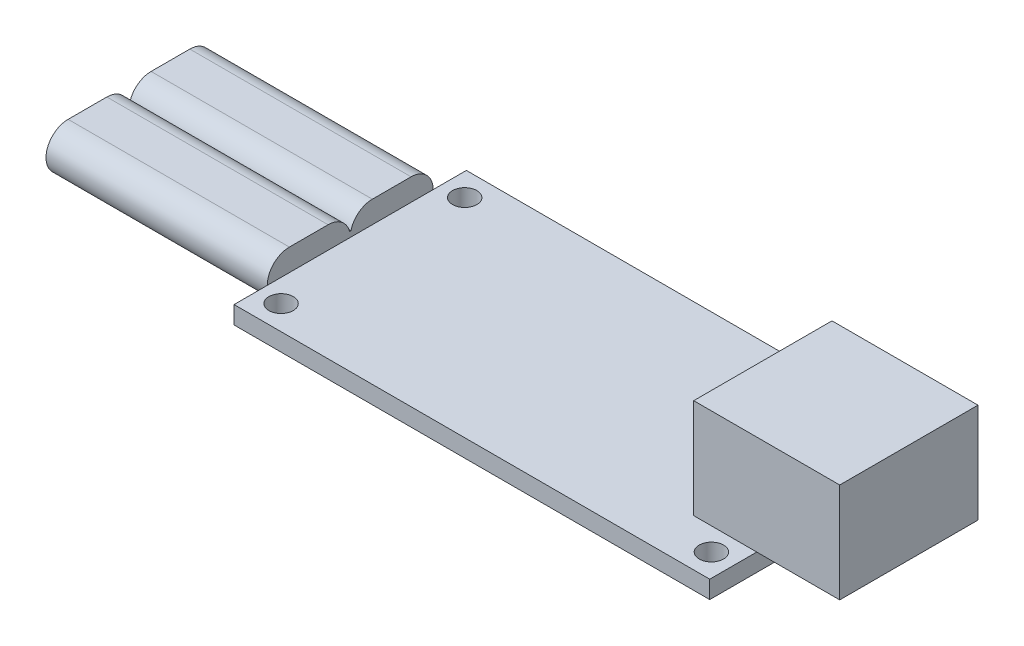
ISO-10303-21;
HEADER;
FILE_DESCRIPTION(('STEP AP214'),'2;1');
FILE_NAME('part.step','',(''),(''),'','','');
FILE_SCHEMA(('AUTOMOTIVE_DESIGN { 1 0 10303 214 1 1 1 1 }'));
ENDSEC;
DATA;
#1=APPLICATION_CONTEXT('core data for automotive mechanical design processes');
#2=APPLICATION_PROTOCOL_DEFINITION('international standard','automotive_design',2000,#1);
#3=PRODUCT_CONTEXT('',#1,'mechanical');
#4=PRODUCT('Part','Part','',(#3));
#5=PRODUCT_RELATED_PRODUCT_CATEGORY('part','',(#4));
#6=PRODUCT_DEFINITION_FORMATION('','',#4);
#7=PRODUCT_DEFINITION_CONTEXT('part definition',#1,'design');
#8=PRODUCT_DEFINITION('design','',#6,#7);
#9=PRODUCT_DEFINITION_SHAPE('','',#8);
#10=(LENGTH_UNIT() NAMED_UNIT(*) SI_UNIT(.MILLI.,.METRE.));
#11=(NAMED_UNIT(*) PLANE_ANGLE_UNIT() SI_UNIT($,.RADIAN.));
#12=(NAMED_UNIT(*) SI_UNIT($,.STERADIAN.) SOLID_ANGLE_UNIT());
#13=UNCERTAINTY_MEASURE_WITH_UNIT(LENGTH_MEASURE(1.E-05),#10,'distance_accuracy_value','');
#14=(GEOMETRIC_REPRESENTATION_CONTEXT(3) GLOBAL_UNCERTAINTY_ASSIGNED_CONTEXT((#13)) GLOBAL_UNIT_ASSIGNED_CONTEXT((#10,
#11,#12)) REPRESENTATION_CONTEXT('',''));
#15=CARTESIAN_POINT('',(0.,0.,0.));
#16=DIRECTION('',(0.,0.,1.));
#17=DIRECTION('',(1.,0.,0.));
#18=AXIS2_PLACEMENT_3D('',#15,#16,#17);
#19=CARTESIAN_POINT('',(0.,1.6,0.));
#20=DIRECTION('',(0.,-1.,0.));
#21=DIRECTION('',(0.,0.,-1.));
#22=AXIS2_PLACEMENT_3D('',#19,#20,#21);
#23=PLANE('',#22);
#24=CARTESIAN_POINT('',(2.05000000000009,1.6,-2.2));
#25=DIRECTION('',(0.,1.,0.));
#26=DIRECTION('',(0.,0.,1.));
#27=AXIS2_PLACEMENT_3D('',#24,#25,#26);
#28=CIRCLE('',#27,1.1);
#29=CARTESIAN_POINT('',(2.05000000000009,1.6,-1.1));
#30=VERTEX_POINT('',#29);
#31=EDGE_CURVE('E321',#30,#30,#28,.T.);
#32=ORIENTED_EDGE('',*,*,#31,.F.);
#33=EDGE_LOOP('',(#32));
#34=FACE_BOUND('',#33,.T.);
#35=CARTESIAN_POINT('',(40.9500000000001,1.6,-2.2));
#36=DIRECTION('',(0.,1.,0.));
#37=DIRECTION('',(0.,0.,1.));
#38=AXIS2_PLACEMENT_3D('',#35,#36,#37);
#39=CIRCLE('',#38,1.1);
#40=CARTESIAN_POINT('',(40.9500000000001,1.6,-1.1));
#41=VERTEX_POINT('',#40);
#42=EDGE_CURVE('E327',#41,#41,#39,.T.);
#43=ORIENTED_EDGE('',*,*,#42,.F.);
#44=EDGE_LOOP('',(#43));
#45=FACE_BOUND('',#44,.T.);
#46=CARTESIAN_POINT('',(40.9499999999999,1.6,-18.8));
#47=DIRECTION('',(0.,1.,0.));
#48=DIRECTION('',(0.,0.,1.));
#49=AXIS2_PLACEMENT_3D('',#46,#47,#48);
#50=CIRCLE('',#49,1.1);
#51=CARTESIAN_POINT('',(40.9499999999999,1.6,-17.7));
#52=VERTEX_POINT('',#51);
#53=EDGE_CURVE('E333',#52,#52,#50,.T.);
#54=ORIENTED_EDGE('',*,*,#53,.F.);
#55=EDGE_LOOP('',(#54));
#56=FACE_BOUND('',#55,.T.);
#57=CARTESIAN_POINT('',(2.04999999999991,1.6,-18.8));
#58=DIRECTION('',(0.,1.,0.));
#59=DIRECTION('',(0.,0.,1.));
#60=AXIS2_PLACEMENT_3D('',#57,#58,#59);
#61=CIRCLE('',#60,1.1);
#62=CARTESIAN_POINT('',(2.04999999999991,1.6,-17.7));
#63=VERTEX_POINT('',#62);
#64=EDGE_CURVE('E339',#63,#63,#61,.T.);
#65=ORIENTED_EDGE('',*,*,#64,.F.);
#66=EDGE_LOOP('',(#65));
#67=FACE_BOUND('',#66,.T.);
#68=DIRECTION('',(1.,0.,0.));
#69=VECTOR('',#68,1.);
#70=CARTESIAN_POINT('',(37.3,1.6,-4.25));
#71=LINE('',#70,#69);
#72=CARTESIAN_POINT('',(37.3,1.6,-4.25));
#73=VERTEX_POINT('',#72);
#74=CARTESIAN_POINT('',(43.,1.6,-4.25));
#75=VERTEX_POINT('',#74);
#76=EDGE_CURVE('E54',#73,#75,#71,.T.);
#77=ORIENTED_EDGE('',*,*,#76,.F.);
#78=DIRECTION('',(0.,0.,1.));
#79=VECTOR('',#78,1.);
#80=CARTESIAN_POINT('',(37.3,1.6,-16.75));
#81=LINE('',#80,#79);
#82=CARTESIAN_POINT('',(37.3,1.6,-16.75));
#83=VERTEX_POINT('',#82);
#84=EDGE_CURVE('E59',#83,#73,#81,.T.);
#85=ORIENTED_EDGE('',*,*,#84,.F.);
#86=DIRECTION('',(-1.,0.,0.));
#87=VECTOR('',#86,1.);
#88=CARTESIAN_POINT('',(37.3,1.6,-16.75));
#89=LINE('',#88,#87);
#90=CARTESIAN_POINT('',(43.,1.6,-16.75));
#91=VERTEX_POINT('',#90);
#92=EDGE_CURVE('E448',#91,#83,#89,.T.);
#93=ORIENTED_EDGE('',*,*,#92,.F.);
#94=DIRECTION('',(0.,0.,-1.));
#95=VECTOR('',#94,1.);
#96=CARTESIAN_POINT('',(43.,1.6,0.));
#97=LINE('',#96,#95);
#98=CARTESIAN_POINT('',(43.,1.6,-21.));
#99=VERTEX_POINT('',#98);
#100=EDGE_CURVE('E352',#91,#99,#97,.T.);
#101=ORIENTED_EDGE('',*,*,#100,.T.);
#102=DIRECTION('',(-1.,0.,0.));
#103=VECTOR('',#102,1.);
#104=CARTESIAN_POINT('',(0.,1.6,-21.));
#105=LINE('',#104,#103);
#106=CARTESIAN_POINT('',(0.,1.6,-21.));
#107=VERTEX_POINT('',#106);
#108=EDGE_CURVE('E355',#99,#107,#105,.T.);
#109=ORIENTED_EDGE('',*,*,#108,.T.);
#110=DIRECTION('',(0.,0.,1.));
#111=VECTOR('',#110,1.);
#112=CARTESIAN_POINT('',(0.,1.6,0.));
#113=LINE('',#112,#111);
#114=CARTESIAN_POINT('',(0.,1.6,-18.));
#115=VERTEX_POINT('',#114);
#116=EDGE_CURVE('E345',#107,#115,#113,.T.);
#117=ORIENTED_EDGE('',*,*,#116,.T.);
#118=CARTESIAN_POINT('',(0.,1.6,-3.));
#119=VERTEX_POINT('',#118);
#120=EDGE_CURVE('E349',#115,#119,#113,.T.);
#121=ORIENTED_EDGE('',*,*,#120,.T.);
#122=CARTESIAN_POINT('',(0.,1.6,0.));
#123=VERTEX_POINT('',#122);
#124=EDGE_CURVE('E350',#119,#123,#113,.T.);
#125=ORIENTED_EDGE('',*,*,#124,.T.);
#126=DIRECTION('',(1.,0.,0.));
#127=VECTOR('',#126,1.);
#128=CARTESIAN_POINT('',(0.,1.6,0.));
#129=LINE('',#128,#127);
#130=CARTESIAN_POINT('',(43.,1.6,0.));
#131=VERTEX_POINT('',#130);
#132=EDGE_CURVE('E348',#123,#131,#129,.T.);
#133=ORIENTED_EDGE('',*,*,#132,.T.);
#134=EDGE_CURVE('E353',#131,#75,#97,.T.);
#135=ORIENTED_EDGE('',*,*,#134,.T.);
#136=EDGE_LOOP('',(#77,#85,#93,#101,#109,#117,#121,#125,#133,#135));
#137=FACE_BOUND('',#136,.T.);
#138=ADVANCED_FACE('F35',(#34,#45,#56,#67,#137),#23,.F.);
#139=CARTESIAN_POINT('',(0.,1.6,0.));
#140=DIRECTION('',(1.,0.,0.));
#141=DIRECTION('',(0.,0.,-1.));
#142=AXIS2_PLACEMENT_3D('',#139,#140,#141);
#143=PLANE('',#142);
#144=CARTESIAN_POINT('',(0.,1.6,-16.));
#145=DIRECTION('',(-1.,0.,0.));
#146=DIRECTION('',(0.,0.,1.));
#147=AXIS2_PLACEMENT_3D('',#144,#145,#146);
#148=CIRCLE('',#147,2.);
#149=CARTESIAN_POINT('',(0.,0.,-17.2));
#150=VERTEX_POINT('',#149);
#151=EDGE_CURVE('E11',#115,#150,#148,.T.);
#152=ORIENTED_EDGE('',*,*,#151,.F.);
#153=ORIENTED_EDGE('',*,*,#116,.F.);
#154=DIRECTION('',(0.,-1.,0.));
#155=VECTOR('',#154,1.);
#156=CARTESIAN_POINT('',(0.,1.6,-21.));
#157=LINE('',#156,#155);
#158=CARTESIAN_POINT('',(0.,0.,-21.));
#159=VERTEX_POINT('',#158);
#160=EDGE_CURVE('E358',#107,#159,#157,.T.);
#161=ORIENTED_EDGE('',*,*,#160,.T.);
#162=DIRECTION('',(0.,0.,1.));
#163=VECTOR('',#162,1.);
#164=CARTESIAN_POINT('',(0.,0.,0.));
#165=LINE('',#164,#163);
#166=EDGE_CURVE('E359',#159,#150,#165,.T.);
#167=ORIENTED_EDGE('',*,*,#166,.T.);
#168=EDGE_LOOP('',(#152,#153,#161,#167));
#169=FACE_BOUND('',#168,.T.);
#170=ADVANCED_FACE('F471',(#169),#143,.F.);
#171=CARTESIAN_POINT('',(0.,1.6,-5.));
#172=DIRECTION('',(-1.,0.,0.));
#173=DIRECTION('',(0.,0.,1.));
#174=AXIS2_PLACEMENT_3D('',#171,#172,#173);
#175=CIRCLE('',#174,2.);
#176=CARTESIAN_POINT('',(0.,0.,-3.8));
#177=VERTEX_POINT('',#176);
#178=EDGE_CURVE('E44',#177,#119,#175,.T.);
#179=ORIENTED_EDGE('',*,*,#178,.F.);
#180=CARTESIAN_POINT('',(0.,0.,0.));
#181=VERTEX_POINT('',#180);
#182=EDGE_CURVE('E342',#177,#181,#165,.T.);
#183=ORIENTED_EDGE('',*,*,#182,.T.);
#184=DIRECTION('',(0.,-1.,0.));
#185=VECTOR('',#184,1.);
#186=CARTESIAN_POINT('',(0.,1.6,0.));
#187=LINE('',#186,#185);
#188=EDGE_CURVE('E39',#123,#181,#187,.T.);
#189=ORIENTED_EDGE('',*,*,#188,.F.);
#190=ORIENTED_EDGE('',*,*,#124,.F.);
#191=EDGE_LOOP('',(#179,#183,#189,#190));
#192=FACE_BOUND('',#191,.T.);
#193=ADVANCED_FACE('F431',(#192),#143,.F.);
#194=CARTESIAN_POINT('',(0.,0.,0.));
#195=DIRECTION('',(0.,-1.,0.));
#196=DIRECTION('',(0.,0.,-1.));
#197=AXIS2_PLACEMENT_3D('',#194,#195,#196);
#198=PLANE('',#197);
#199=CARTESIAN_POINT('',(40.9500000000001,0.,-2.2));
#200=DIRECTION('',(0.,1.,0.));
#201=DIRECTION('',(0.,0.,1.));
#202=AXIS2_PLACEMENT_3D('',#199,#200,#201);
#203=CIRCLE('',#202,1.1);
#204=CARTESIAN_POINT('',(40.9500000000001,0.,-1.1));
#205=VERTEX_POINT('',#204);
#206=EDGE_CURVE('E324',#205,#205,#203,.T.);
#207=ORIENTED_EDGE('',*,*,#206,.T.);
#208=EDGE_LOOP('',(#207));
#209=FACE_BOUND('',#208,.T.);
#210=CARTESIAN_POINT('',(2.04999999999991,0.,-18.8));
#211=DIRECTION('',(0.,1.,0.));
#212=DIRECTION('',(0.,0.,1.));
#213=AXIS2_PLACEMENT_3D('',#210,#211,#212);
#214=CIRCLE('',#213,1.1);
#215=CARTESIAN_POINT('',(2.04999999999991,0.,-17.7));
#216=VERTEX_POINT('',#215);
#217=EDGE_CURVE('E336',#216,#216,#214,.T.);
#218=ORIENTED_EDGE('',*,*,#217,.T.);
#219=EDGE_LOOP('',(#218));
#220=FACE_BOUND('',#219,.T.);
#221=ORIENTED_EDGE('',*,*,#166,.F.);
#222=DIRECTION('',(-1.,0.,0.));
#223=VECTOR('',#222,1.);
#224=CARTESIAN_POINT('',(0.,0.,-21.));
#225=LINE('',#224,#223);
#226=CARTESIAN_POINT('',(43.,0.,-21.));
#227=VERTEX_POINT('',#226);
#228=EDGE_CURVE('E367',#227,#159,#225,.T.);
#229=ORIENTED_EDGE('',*,*,#228,.F.);
#230=DIRECTION('',(0.,0.,-1.));
#231=VECTOR('',#230,1.);
#232=CARTESIAN_POINT('',(43.,0.,0.));
#233=LINE('',#232,#231);
#234=CARTESIAN_POINT('',(43.,0.,0.));
#235=VERTEX_POINT('',#234);
#236=EDGE_CURVE('E365',#235,#227,#233,.T.);
#237=ORIENTED_EDGE('',*,*,#236,.F.);
#238=DIRECTION('',(1.,0.,0.));
#239=VECTOR('',#238,1.);
#240=CARTESIAN_POINT('',(0.,0.,0.));
#241=LINE('',#240,#239);
#242=EDGE_CURVE('E362',#181,#235,#241,.T.);
#243=ORIENTED_EDGE('',*,*,#242,.F.);
#244=ORIENTED_EDGE('',*,*,#182,.F.);
#245=CARTESIAN_POINT('',(0.,0.,-9.7));
#246=VERTEX_POINT('',#245);
#247=EDGE_CURVE('E423',#246,#177,#165,.T.);
#248=ORIENTED_EDGE('',*,*,#247,.F.);
#249=CARTESIAN_POINT('',(0.,0.,-11.3));
#250=VERTEX_POINT('',#249);
#251=EDGE_CURVE('E428',#250,#246,#165,.T.);
#252=ORIENTED_EDGE('',*,*,#251,.F.);
#253=EDGE_CURVE('E363',#150,#250,#165,.T.);
#254=ORIENTED_EDGE('',*,*,#253,.F.);
#255=EDGE_LOOP('',(#221,#229,#237,#243,#244,#248,#252,#254));
#256=FACE_BOUND('',#255,.T.);
#257=CARTESIAN_POINT('',(40.9499999999999,0.,-18.8));
#258=DIRECTION('',(0.,1.,0.));
#259=DIRECTION('',(0.,0.,1.));
#260=AXIS2_PLACEMENT_3D('',#257,#258,#259);
#261=CIRCLE('',#260,1.1);
#262=CARTESIAN_POINT('',(40.9499999999999,0.,-17.7));
#263=VERTEX_POINT('',#262);
#264=EDGE_CURVE('E330',#263,#263,#261,.T.);
#265=ORIENTED_EDGE('',*,*,#264,.T.);
#266=EDGE_LOOP('',(#265));
#267=FACE_BOUND('',#266,.T.);
#268=CARTESIAN_POINT('',(2.05000000000009,0.,-2.2));
#269=DIRECTION('',(0.,1.,0.));
#270=DIRECTION('',(0.,0.,1.));
#271=AXIS2_PLACEMENT_3D('',#268,#269,#270);
#272=CIRCLE('',#271,1.1);
#273=CARTESIAN_POINT('',(2.05000000000009,0.,-1.1));
#274=VERTEX_POINT('',#273);
#275=EDGE_CURVE('E320',#274,#274,#272,.T.);
#276=ORIENTED_EDGE('',*,*,#275,.T.);
#277=EDGE_LOOP('',(#276));
#278=FACE_BOUND('',#277,.T.);
#279=ADVANCED_FACE('F433',(#209,#220,#256,#267,#278),#198,.T.);
#280=CARTESIAN_POINT('',(0.,1.6,-12.5));
#281=DIRECTION('',(-1.,0.,0.));
#282=DIRECTION('',(0.,0.,1.));
#283=AXIS2_PLACEMENT_3D('',#280,#281,#282);
#284=CIRCLE('',#283,2.);
#285=CARTESIAN_POINT('',(0.,1.10392162917539,-10.5625));
#286=VERTEX_POINT('',#285);
#287=EDGE_CURVE('E227',#250,#286,#284,.T.);
#288=ORIENTED_EDGE('',*,*,#287,.F.);
#289=ORIENTED_EDGE('',*,*,#251,.T.);
#290=CARTESIAN_POINT('',(0.,1.6,-8.5));
#291=DIRECTION('',(-1.,0.,0.));
#292=DIRECTION('',(0.,0.,1.));
#293=AXIS2_PLACEMENT_3D('',#290,#291,#292);
#294=CIRCLE('',#293,2.);
#295=CARTESIAN_POINT('',(0.,1.10392162917539,-10.4375));
#296=VERTEX_POINT('',#295);
#297=EDGE_CURVE('E264',#296,#246,#294,.T.);
#298=ORIENTED_EDGE('',*,*,#297,.F.);
#299=CARTESIAN_POINT('',(0.,1.6,-10.5));
#300=DIRECTION('',(-1.,0.,0.));
#301=DIRECTION('',(0.,0.,1.));
#302=AXIS2_PLACEMENT_3D('',#299,#300,#301);
#303=CIRCLE('',#302,0.500000000000001);
#304=EDGE_CURVE('E225',#286,#296,#303,.T.);
#305=ORIENTED_EDGE('',*,*,#304,.F.);
#306=EDGE_LOOP('',(#288,#289,#298,#305));
#307=FACE_BOUND('',#306,.T.);
#308=ADVANCED_FACE('F37',(#307),#143,.F.);
#309=CARTESIAN_POINT('',(0.,1.6,0.));
#310=DIRECTION('',(0.,0.,-1.));
#311=DIRECTION('',(-1.,0.,0.));
#312=AXIS2_PLACEMENT_3D('',#309,#310,#311);
#313=PLANE('',#312);
#314=ORIENTED_EDGE('',*,*,#242,.T.);
#315=DIRECTION('',(0.,-1.,0.));
#316=VECTOR('',#315,1.);
#317=CARTESIAN_POINT('',(43.,1.6,0.));
#318=LINE('',#317,#316);
#319=EDGE_CURVE('E373',#131,#235,#318,.T.);
#320=ORIENTED_EDGE('',*,*,#319,.F.);
#321=ORIENTED_EDGE('',*,*,#132,.F.);
#322=ORIENTED_EDGE('',*,*,#188,.T.);
#323=EDGE_LOOP('',(#314,#320,#321,#322));
#324=FACE_BOUND('',#323,.T.);
#325=ADVANCED_FACE('F436',(#324),#313,.F.);
#326=CARTESIAN_POINT('',(43.,1.6,0.));
#327=DIRECTION('',(-1.,0.,0.));
#328=DIRECTION('',(0.,0.,1.));
#329=AXIS2_PLACEMENT_3D('',#326,#327,#328);
#330=PLANE('',#329);
#331=ORIENTED_EDGE('',*,*,#236,.T.);
#332=DIRECTION('',(0.,-1.,0.));
#333=VECTOR('',#332,1.);
#334=CARTESIAN_POINT('',(43.,1.6,-21.));
#335=LINE('',#334,#333);
#336=EDGE_CURVE('E371',#99,#227,#335,.T.);
#337=ORIENTED_EDGE('',*,*,#336,.F.);
#338=ORIENTED_EDGE('',*,*,#100,.F.);
#339=EDGE_CURVE('E356',#75,#91,#97,.T.);
#340=ORIENTED_EDGE('',*,*,#339,.F.);
#341=ORIENTED_EDGE('',*,*,#134,.F.);
#342=ORIENTED_EDGE('',*,*,#319,.T.);
#343=EDGE_LOOP('',(#331,#337,#338,#340,#341,#342));
#344=FACE_BOUND('',#343,.T.);
#345=ADVANCED_FACE('F437',(#344),#330,.F.);
#346=CARTESIAN_POINT('',(0.,1.6,-21.));
#347=DIRECTION('',(0.,0.,1.));
#348=DIRECTION('',(1.,0.,0.));
#349=AXIS2_PLACEMENT_3D('',#346,#347,#348);
#350=PLANE('',#349);
#351=ORIENTED_EDGE('',*,*,#228,.T.);
#352=ORIENTED_EDGE('',*,*,#160,.F.);
#353=ORIENTED_EDGE('',*,*,#108,.F.);
#354=ORIENTED_EDGE('',*,*,#336,.T.);
#355=EDGE_LOOP('',(#351,#352,#353,#354));
#356=FACE_BOUND('',#355,.T.);
#357=ADVANCED_FACE('F487',(#356),#350,.F.);
#358=CARTESIAN_POINT('',(2.04999999999991,1.6,-18.8));
#359=DIRECTION('',(0.,-1.,0.));
#360=DIRECTION('',(0.,0.,-1.));
#361=AXIS2_PLACEMENT_3D('',#358,#359,#360);
#362=CYLINDRICAL_SURFACE('',#361,1.1);
#363=ORIENTED_EDGE('',*,*,#64,.T.);
#364=EDGE_LOOP('',(#363));
#365=FACE_BOUND('',#364,.T.);
#366=ORIENTED_EDGE('',*,*,#217,.F.);
#367=EDGE_LOOP('',(#366));
#368=FACE_BOUND('',#367,.T.);
#369=ADVANCED_FACE('F482',(#365,#368),#362,.F.);
#370=CARTESIAN_POINT('',(40.9499999999999,1.6,-18.8));
#371=DIRECTION('',(0.,-1.,0.));
#372=DIRECTION('',(0.,0.,-1.));
#373=AXIS2_PLACEMENT_3D('',#370,#371,#372);
#374=CYLINDRICAL_SURFACE('',#373,1.1);
#375=ORIENTED_EDGE('',*,*,#53,.T.);
#376=EDGE_LOOP('',(#375));
#377=FACE_BOUND('',#376,.T.);
#378=ORIENTED_EDGE('',*,*,#264,.F.);
#379=EDGE_LOOP('',(#378));
#380=FACE_BOUND('',#379,.T.);
#381=ADVANCED_FACE('F724',(#377,#380),#374,.F.);
#382=CARTESIAN_POINT('',(40.9500000000001,1.6,-2.2));
#383=DIRECTION('',(0.,-1.,0.));
#384=DIRECTION('',(0.,0.,-1.));
#385=AXIS2_PLACEMENT_3D('',#382,#383,#384);
#386=CYLINDRICAL_SURFACE('',#385,1.1);
#387=ORIENTED_EDGE('',*,*,#42,.T.);
#388=EDGE_LOOP('',(#387));
#389=FACE_BOUND('',#388,.T.);
#390=ORIENTED_EDGE('',*,*,#206,.F.);
#391=EDGE_LOOP('',(#390));
#392=FACE_BOUND('',#391,.T.);
#393=ADVANCED_FACE('F721',(#389,#392),#386,.F.);
#394=CARTESIAN_POINT('',(2.05000000000009,1.6,-2.2));
#395=DIRECTION('',(0.,-1.,0.));
#396=DIRECTION('',(0.,0.,-1.));
#397=AXIS2_PLACEMENT_3D('',#394,#395,#396);
#398=CYLINDRICAL_SURFACE('',#397,1.1);
#399=ORIENTED_EDGE('',*,*,#31,.T.);
#400=EDGE_LOOP('',(#399));
#401=FACE_BOUND('',#400,.T.);
#402=ORIENTED_EDGE('',*,*,#275,.F.);
#403=EDGE_LOOP('',(#402));
#404=FACE_BOUND('',#403,.T.);
#405=ADVANCED_FACE('F523',(#401,#404),#398,.F.);
#406=CARTESIAN_POINT('',(0.,0.,0.));
#407=DIRECTION('',(-1.,0.,0.));
#408=DIRECTION('',(0.,0.,1.));
#409=AXIS2_PLACEMENT_3D('',#406,#407,#408);
#410=PLANE('',#409);
#411=CARTESIAN_POINT('',(0.,-0.4,-16.));
#412=VERTEX_POINT('',#411);
#413=EDGE_CURVE('E47',#150,#412,#148,.T.);
#414=ORIENTED_EDGE('',*,*,#413,.F.);
#415=ORIENTED_EDGE('',*,*,#253,.T.);
#416=CARTESIAN_POINT('',(0.,-0.4,-12.5));
#417=VERTEX_POINT('',#416);
#418=EDGE_CURVE('E222',#417,#250,#284,.T.);
#419=ORIENTED_EDGE('',*,*,#418,.F.);
#420=DIRECTION('',(0.,0.,-1.));
#421=VECTOR('',#420,1.);
#422=CARTESIAN_POINT('',(0.,-0.399999999999999,0.));
#423=LINE('',#422,#421);
#424=EDGE_CURVE('E236',#417,#412,#423,.T.);
#425=ORIENTED_EDGE('',*,*,#424,.T.);
#426=EDGE_LOOP('',(#414,#415,#419,#425));
#427=FACE_BOUND('',#426,.T.);
#428=ADVANCED_FACE('F518',(#427),#410,.F.);
#429=CARTESIAN_POINT('',(0.,-0.4,-8.5));
#430=VERTEX_POINT('',#429);
#431=EDGE_CURVE('E263',#246,#430,#294,.T.);
#432=ORIENTED_EDGE('',*,*,#431,.F.);
#433=ORIENTED_EDGE('',*,*,#247,.T.);
#434=CARTESIAN_POINT('',(0.,-0.399999999999999,-5.));
#435=VERTEX_POINT('',#434);
#436=EDGE_CURVE('E270',#435,#177,#175,.T.);
#437=ORIENTED_EDGE('',*,*,#436,.F.);
#438=DIRECTION('',(0.,0.,1.));
#439=VECTOR('',#438,1.);
#440=CARTESIAN_POINT('',(0.,-0.399999999999997,0.));
#441=LINE('',#440,#439);
#442=EDGE_CURVE('E267',#430,#435,#441,.T.);
#443=ORIENTED_EDGE('',*,*,#442,.F.);
#444=EDGE_LOOP('',(#432,#433,#437,#443));
#445=FACE_BOUND('',#444,.T.);
#446=ADVANCED_FACE('F422',(#445),#410,.F.);
#447=CARTESIAN_POINT('',(-20.,1.6,-12.5));
#448=DIRECTION('',(1.,0.,0.));
#449=DIRECTION('',(0.,0.,-1.));
#450=AXIS2_PLACEMENT_3D('',#447,#448,#449);
#451=CYLINDRICAL_SURFACE('',#450,2.);
#452=ORIENTED_EDGE('',*,*,#418,.T.);
#453=ORIENTED_EDGE('',*,*,#287,.T.);
#454=DIRECTION('',(1.,0.,0.));
#455=VECTOR('',#454,1.);
#456=CARTESIAN_POINT('',(-20.,1.10392162917539,-10.5625));
#457=LINE('',#456,#455);
#458=CARTESIAN_POINT('',(-20.,1.10392162917539,-10.5625));
#459=VERTEX_POINT('',#458);
#460=EDGE_CURVE('E317',#459,#286,#457,.T.);
#461=ORIENTED_EDGE('',*,*,#460,.F.);
#462=CARTESIAN_POINT('',(-20.,1.6,-12.5));
#463=DIRECTION('',(-1.,0.,0.));
#464=DIRECTION('',(0.,0.,1.));
#465=AXIS2_PLACEMENT_3D('',#462,#463,#464);
#466=CIRCLE('',#465,2.);
#467=CARTESIAN_POINT('',(-20.,-0.4,-12.5));
#468=VERTEX_POINT('',#467);
#469=EDGE_CURVE('E232',#468,#459,#466,.T.);
#470=ORIENTED_EDGE('',*,*,#469,.F.);
#471=DIRECTION('',(1.,0.,0.));
#472=VECTOR('',#471,1.);
#473=CARTESIAN_POINT('',(-20.,-0.4,-12.5));
#474=LINE('',#473,#472);
#475=EDGE_CURVE('E259',#468,#417,#474,.T.);
#476=ORIENTED_EDGE('',*,*,#475,.T.);
#477=EDGE_LOOP('',(#452,#453,#461,#470,#476));
#478=FACE_BOUND('',#477,.T.);
#479=ADVANCED_FACE('F536',(#478),#451,.T.);
#480=CARTESIAN_POINT('',(-20.,1.6,-10.5));
#481=DIRECTION('',(1.,0.,0.));
#482=DIRECTION('',(0.,0.,-1.));
#483=AXIS2_PLACEMENT_3D('',#480,#481,#482);
#484=CYLINDRICAL_SURFACE('',#483,0.500000000000001);
#485=ORIENTED_EDGE('',*,*,#304,.T.);
#486=DIRECTION('',(1.,0.,0.));
#487=VECTOR('',#486,1.);
#488=CARTESIAN_POINT('',(-20.,1.10392162917539,-10.4375));
#489=LINE('',#488,#487);
#490=CARTESIAN_POINT('',(-20.,1.10392162917539,-10.4375));
#491=VERTEX_POINT('',#490);
#492=EDGE_CURVE('E314',#491,#296,#489,.T.);
#493=ORIENTED_EDGE('',*,*,#492,.F.);
#494=CARTESIAN_POINT('',(-20.,1.6,-10.5));
#495=DIRECTION('',(-1.,0.,0.));
#496=DIRECTION('',(0.,0.,1.));
#497=AXIS2_PLACEMENT_3D('',#494,#495,#496);
#498=CIRCLE('',#497,0.500000000000001);
#499=EDGE_CURVE('E235',#459,#491,#498,.T.);
#500=ORIENTED_EDGE('',*,*,#499,.F.);
#501=ORIENTED_EDGE('',*,*,#460,.T.);
#502=EDGE_LOOP('',(#485,#493,#500,#501));
#503=FACE_BOUND('',#502,.T.);
#504=ADVANCED_FACE('F545',(#503),#484,.T.);
#505=CARTESIAN_POINT('',(-20.,1.6,-8.5));
#506=DIRECTION('',(1.,0.,0.));
#507=DIRECTION('',(0.,0.,-1.));
#508=AXIS2_PLACEMENT_3D('',#505,#506,#507);
#509=CYLINDRICAL_SURFACE('',#508,2.);
#510=ORIENTED_EDGE('',*,*,#297,.T.);
#511=ORIENTED_EDGE('',*,*,#431,.T.);
#512=DIRECTION('',(1.,0.,0.));
#513=VECTOR('',#512,1.);
#514=CARTESIAN_POINT('',(-20.,-0.4,-8.5));
#515=LINE('',#514,#513);
#516=CARTESIAN_POINT('',(-20.,-0.4,-8.5));
#517=VERTEX_POINT('',#516);
#518=EDGE_CURVE('E311',#517,#430,#515,.T.);
#519=ORIENTED_EDGE('',*,*,#518,.F.);
#520=CARTESIAN_POINT('',(-20.,1.6,-8.5));
#521=DIRECTION('',(-1.,0.,0.));
#522=DIRECTION('',(0.,0.,1.));
#523=AXIS2_PLACEMENT_3D('',#520,#521,#522);
#524=CIRCLE('',#523,2.);
#525=EDGE_CURVE('E238',#491,#517,#524,.T.);
#526=ORIENTED_EDGE('',*,*,#525,.F.);
#527=ORIENTED_EDGE('',*,*,#492,.T.);
#528=EDGE_LOOP('',(#510,#511,#519,#526,#527));
#529=FACE_BOUND('',#528,.T.);
#530=ADVANCED_FACE('F554',(#529),#509,.T.);
#531=CARTESIAN_POINT('',(-20.,-0.399999999999997,0.));
#532=DIRECTION('',(0.,1.,0.));
#533=DIRECTION('',(0.,0.,1.));
#534=AXIS2_PLACEMENT_3D('',#531,#532,#533);
#535=PLANE('',#534);
#536=ORIENTED_EDGE('',*,*,#442,.T.);
#537=DIRECTION('',(1.,0.,0.));
#538=VECTOR('',#537,1.);
#539=CARTESIAN_POINT('',(-20.,-0.399999999999999,-5.));
#540=LINE('',#539,#538);
#541=CARTESIAN_POINT('',(-20.,-0.399999999999999,-5.));
#542=VERTEX_POINT('',#541);
#543=EDGE_CURVE('E308',#542,#435,#540,.T.);
#544=ORIENTED_EDGE('',*,*,#543,.F.);
#545=DIRECTION('',(0.,0.,1.));
#546=VECTOR('',#545,1.);
#547=CARTESIAN_POINT('',(-20.,-0.399999999999997,0.));
#548=LINE('',#547,#546);
#549=EDGE_CURVE('E240',#517,#542,#548,.T.);
#550=ORIENTED_EDGE('',*,*,#549,.F.);
#551=ORIENTED_EDGE('',*,*,#518,.T.);
#552=EDGE_LOOP('',(#536,#544,#550,#551));
#553=FACE_BOUND('',#552,.T.);
#554=ADVANCED_FACE('F564',(#553),#535,.F.);
#555=CARTESIAN_POINT('',(-20.,1.6,-5.));
#556=DIRECTION('',(1.,0.,0.));
#557=DIRECTION('',(0.,0.,-1.));
#558=AXIS2_PLACEMENT_3D('',#555,#556,#557);
#559=CYLINDRICAL_SURFACE('',#558,2.);
#560=ORIENTED_EDGE('',*,*,#436,.T.);
#561=ORIENTED_EDGE('',*,*,#178,.T.);
#562=CARTESIAN_POINT('',(0.,3.6,-5.));
#563=VERTEX_POINT('',#562);
#564=EDGE_CURVE('E269',#119,#563,#175,.T.);
#565=ORIENTED_EDGE('',*,*,#564,.T.);
#566=DIRECTION('',(1.,0.,0.));
#567=VECTOR('',#566,1.);
#568=CARTESIAN_POINT('',(-20.,3.6,-5.));
#569=LINE('',#568,#567);
#570=CARTESIAN_POINT('',(-20.,3.6,-5.));
#571=VERTEX_POINT('',#570);
#572=EDGE_CURVE('E305',#571,#563,#569,.T.);
#573=ORIENTED_EDGE('',*,*,#572,.F.);
#574=CARTESIAN_POINT('',(-20.,1.6,-5.));
#575=DIRECTION('',(-1.,0.,0.));
#576=DIRECTION('',(0.,0.,1.));
#577=AXIS2_PLACEMENT_3D('',#574,#575,#576);
#578=CIRCLE('',#577,2.);
#579=EDGE_CURVE('E242',#542,#571,#578,.T.);
#580=ORIENTED_EDGE('',*,*,#579,.F.);
#581=ORIENTED_EDGE('',*,*,#543,.T.);
#582=EDGE_LOOP('',(#560,#561,#565,#573,#580,#581));
#583=FACE_BOUND('',#582,.T.);
#584=ADVANCED_FACE('F390',(#583),#559,.T.);
#585=CARTESIAN_POINT('',(-20.,3.6,0.));
#586=DIRECTION('',(0.,1.,0.));
#587=DIRECTION('',(0.,0.,1.));
#588=AXIS2_PLACEMENT_3D('',#585,#586,#587);
#589=PLANE('',#588);
#590=DIRECTION('',(0.,0.,1.));
#591=VECTOR('',#590,1.);
#592=CARTESIAN_POINT('',(0.,3.6,0.));
#593=LINE('',#592,#591);
#594=CARTESIAN_POINT('',(0.,3.6,-8.5));
#595=VERTEX_POINT('',#594);
#596=EDGE_CURVE('E273',#595,#563,#593,.T.);
#597=ORIENTED_EDGE('',*,*,#596,.F.);
#598=DIRECTION('',(1.,0.,0.));
#599=VECTOR('',#598,1.);
#600=CARTESIAN_POINT('',(-20.,3.6,-8.5));
#601=LINE('',#600,#599);
#602=CARTESIAN_POINT('',(-20.,3.6,-8.5));
#603=VERTEX_POINT('',#602);
#604=EDGE_CURVE('E303',#603,#595,#601,.T.);
#605=ORIENTED_EDGE('',*,*,#604,.F.);
#606=DIRECTION('',(0.,0.,1.));
#607=VECTOR('',#606,1.);
#608=CARTESIAN_POINT('',(-20.,3.6,0.));
#609=LINE('',#608,#607);
#610=EDGE_CURVE('E244',#603,#571,#609,.T.);
#611=ORIENTED_EDGE('',*,*,#610,.T.);
#612=ORIENTED_EDGE('',*,*,#572,.T.);
#613=EDGE_LOOP('',(#597,#605,#611,#612));
#614=FACE_BOUND('',#613,.T.);
#615=ADVANCED_FACE('F396',(#614),#589,.T.);
#616=CARTESIAN_POINT('',(-20.,1.6,-8.5));
#617=DIRECTION('',(1.,0.,0.));
#618=DIRECTION('',(0.,0.,-1.));
#619=AXIS2_PLACEMENT_3D('',#616,#617,#618);
#620=CYLINDRICAL_SURFACE('',#619,2.);
#621=CARTESIAN_POINT('',(0.,1.6,-8.5));
#622=DIRECTION('',(-1.,0.,0.));
#623=DIRECTION('',(0.,0.,1.));
#624=AXIS2_PLACEMENT_3D('',#621,#622,#623);
#625=CIRCLE('',#624,2.);
#626=CARTESIAN_POINT('',(0.,2.09607837082461,-10.4375));
#627=VERTEX_POINT('',#626);
#628=EDGE_CURVE('E276',#595,#627,#625,.T.);
#629=ORIENTED_EDGE('',*,*,#628,.T.);
#630=DIRECTION('',(1.,0.,0.));
#631=VECTOR('',#630,1.);
#632=CARTESIAN_POINT('',(-20.,2.09607837082461,-10.4375));
#633=LINE('',#632,#631);
#634=CARTESIAN_POINT('',(-20.,2.09607837082461,-10.4375));
#635=VERTEX_POINT('',#634);
#636=EDGE_CURVE('E300',#635,#627,#633,.T.);
#637=ORIENTED_EDGE('',*,*,#636,.F.);
#638=CARTESIAN_POINT('',(-20.,1.6,-8.5));
#639=DIRECTION('',(-1.,0.,0.));
#640=DIRECTION('',(0.,0.,1.));
#641=AXIS2_PLACEMENT_3D('',#638,#639,#640);
#642=CIRCLE('',#641,2.);
#643=EDGE_CURVE('E247',#603,#635,#642,.T.);
#644=ORIENTED_EDGE('',*,*,#643,.F.);
#645=ORIENTED_EDGE('',*,*,#604,.T.);
#646=EDGE_LOOP('',(#629,#637,#644,#645));
#647=FACE_BOUND('',#646,.T.);
#648=ADVANCED_FACE('F404',(#647),#620,.T.);
#649=CARTESIAN_POINT('',(-20.,1.6,-10.5));
#650=DIRECTION('',(1.,0.,0.));
#651=DIRECTION('',(0.,0.,-1.));
#652=AXIS2_PLACEMENT_3D('',#649,#650,#651);
#653=CYLINDRICAL_SURFACE('',#652,0.500000000000001);
#654=CARTESIAN_POINT('',(0.,1.6,-10.5));
#655=DIRECTION('',(-1.,0.,0.));
#656=DIRECTION('',(0.,0.,1.));
#657=AXIS2_PLACEMENT_3D('',#654,#655,#656);
#658=CIRCLE('',#657,0.500000000000001);
#659=CARTESIAN_POINT('',(0.,2.09607837082461,-10.5625));
#660=VERTEX_POINT('',#659);
#661=EDGE_CURVE('E278',#627,#660,#658,.T.);
#662=ORIENTED_EDGE('',*,*,#661,.T.);
#663=DIRECTION('',(1.,0.,0.));
#664=VECTOR('',#663,1.);
#665=CARTESIAN_POINT('',(-20.,2.09607837082461,-10.5625));
#666=LINE('',#665,#664);
#667=CARTESIAN_POINT('',(-20.,2.09607837082461,-10.5625));
#668=VERTEX_POINT('',#667);
#669=EDGE_CURVE('E297',#668,#660,#666,.T.);
#670=ORIENTED_EDGE('',*,*,#669,.F.);
#671=CARTESIAN_POINT('',(-20.,1.6,-10.5));
#672=DIRECTION('',(-1.,0.,0.));
#673=DIRECTION('',(0.,0.,1.));
#674=AXIS2_PLACEMENT_3D('',#671,#672,#673);
#675=CIRCLE('',#674,0.500000000000001);
#676=EDGE_CURVE('E249',#635,#668,#675,.T.);
#677=ORIENTED_EDGE('',*,*,#676,.F.);
#678=ORIENTED_EDGE('',*,*,#636,.T.);
#679=EDGE_LOOP('',(#662,#670,#677,#678));
#680=FACE_BOUND('',#679,.T.);
#681=ADVANCED_FACE('F408',(#680),#653,.T.);
#682=CARTESIAN_POINT('',(-20.,1.6,-12.5));
#683=DIRECTION('',(1.,0.,0.));
#684=DIRECTION('',(0.,0.,-1.));
#685=AXIS2_PLACEMENT_3D('',#682,#683,#684);
#686=CYLINDRICAL_SURFACE('',#685,2.);
#687=CARTESIAN_POINT('',(0.,1.6,-12.5));
#688=DIRECTION('',(-1.,0.,0.));
#689=DIRECTION('',(0.,0.,1.));
#690=AXIS2_PLACEMENT_3D('',#687,#688,#689);
#691=CIRCLE('',#690,2.);
#692=CARTESIAN_POINT('',(0.,3.6,-12.5));
#693=VERTEX_POINT('',#692);
#694=EDGE_CURVE('E280',#660,#693,#691,.T.);
#695=ORIENTED_EDGE('',*,*,#694,.T.);
#696=DIRECTION('',(1.,0.,0.));
#697=VECTOR('',#696,1.);
#698=CARTESIAN_POINT('',(-20.,3.6,-12.5));
#699=LINE('',#698,#697);
#700=CARTESIAN_POINT('',(-20.,3.6,-12.5));
#701=VERTEX_POINT('',#700);
#702=EDGE_CURVE('E294',#701,#693,#699,.T.);
#703=ORIENTED_EDGE('',*,*,#702,.F.);
#704=CARTESIAN_POINT('',(-20.,1.6,-12.5));
#705=DIRECTION('',(-1.,0.,0.));
#706=DIRECTION('',(0.,0.,1.));
#707=AXIS2_PLACEMENT_3D('',#704,#705,#706);
#708=CIRCLE('',#707,2.);
#709=EDGE_CURVE('E251',#668,#701,#708,.T.);
#710=ORIENTED_EDGE('',*,*,#709,.F.);
#711=ORIENTED_EDGE('',*,*,#669,.T.);
#712=EDGE_LOOP('',(#695,#703,#710,#711));
#713=FACE_BOUND('',#712,.T.);
#714=ADVANCED_FACE('F606',(#713),#686,.T.);
#715=CARTESIAN_POINT('',(-20.,3.6,0.));
#716=DIRECTION('',(0.,-1.,0.));
#717=DIRECTION('',(0.,0.,-1.));
#718=AXIS2_PLACEMENT_3D('',#715,#716,#717);
#719=PLANE('',#718);
#720=DIRECTION('',(0.,0.,-1.));
#721=VECTOR('',#720,1.);
#722=CARTESIAN_POINT('',(0.,3.6,0.));
#723=LINE('',#722,#721);
#724=CARTESIAN_POINT('',(0.,3.6,-16.));
#725=VERTEX_POINT('',#724);
#726=EDGE_CURVE('E282',#693,#725,#723,.T.);
#727=ORIENTED_EDGE('',*,*,#726,.T.);
#728=DIRECTION('',(1.,0.,0.));
#729=VECTOR('',#728,1.);
#730=CARTESIAN_POINT('',(-20.,3.6,-16.));
#731=LINE('',#730,#729);
#732=CARTESIAN_POINT('',(-20.,3.6,-16.));
#733=VERTEX_POINT('',#732);
#734=EDGE_CURVE('E291',#733,#725,#731,.T.);
#735=ORIENTED_EDGE('',*,*,#734,.F.);
#736=DIRECTION('',(0.,0.,-1.));
#737=VECTOR('',#736,1.);
#738=CARTESIAN_POINT('',(-20.,3.6,0.));
#739=LINE('',#738,#737);
#740=EDGE_CURVE('E253',#701,#733,#739,.T.);
#741=ORIENTED_EDGE('',*,*,#740,.F.);
#742=ORIENTED_EDGE('',*,*,#702,.T.);
#743=EDGE_LOOP('',(#727,#735,#741,#742));
#744=FACE_BOUND('',#743,.T.);
#745=ADVANCED_FACE('F615',(#744),#719,.F.);
#746=CARTESIAN_POINT('',(-20.,1.6,-16.));
#747=DIRECTION('',(1.,0.,0.));
#748=DIRECTION('',(0.,0.,-1.));
#749=AXIS2_PLACEMENT_3D('',#746,#747,#748);
#750=CYLINDRICAL_SURFACE('',#749,2.);
#751=EDGE_CURVE('E46',#725,#115,#148,.T.);
#752=ORIENTED_EDGE('',*,*,#751,.T.);
#753=ORIENTED_EDGE('',*,*,#151,.T.);
#754=ORIENTED_EDGE('',*,*,#413,.T.);
#755=DIRECTION('',(1.,0.,0.));
#756=VECTOR('',#755,1.);
#757=CARTESIAN_POINT('',(-20.,-0.4,-16.));
#758=LINE('',#757,#756);
#759=CARTESIAN_POINT('',(-20.,-0.4,-16.));
#760=VERTEX_POINT('',#759);
#761=EDGE_CURVE('E288',#760,#412,#758,.T.);
#762=ORIENTED_EDGE('',*,*,#761,.F.);
#763=CARTESIAN_POINT('',(-20.,1.6,-16.));
#764=DIRECTION('',(-1.,0.,0.));
#765=DIRECTION('',(0.,0.,1.));
#766=AXIS2_PLACEMENT_3D('',#763,#764,#765);
#767=CIRCLE('',#766,2.);
#768=EDGE_CURVE('E255',#733,#760,#767,.T.);
#769=ORIENTED_EDGE('',*,*,#768,.F.);
#770=ORIENTED_EDGE('',*,*,#734,.T.);
#771=EDGE_LOOP('',(#752,#753,#754,#762,#769,#770));
#772=FACE_BOUND('',#771,.T.);
#773=ADVANCED_FACE('F625',(#772),#750,.T.);
#774=CARTESIAN_POINT('',(-20.,-0.399999999999999,0.));
#775=DIRECTION('',(0.,-1.,0.));
#776=DIRECTION('',(0.,0.,-1.));
#777=AXIS2_PLACEMENT_3D('',#774,#775,#776);
#778=PLANE('',#777);
#779=ORIENTED_EDGE('',*,*,#424,.F.);
#780=ORIENTED_EDGE('',*,*,#475,.F.);
#781=DIRECTION('',(0.,0.,-1.));
#782=VECTOR('',#781,1.);
#783=CARTESIAN_POINT('',(-20.,-0.399999999999999,0.));
#784=LINE('',#783,#782);
#785=EDGE_CURVE('E257',#468,#760,#784,.T.);
#786=ORIENTED_EDGE('',*,*,#785,.T.);
#787=ORIENTED_EDGE('',*,*,#761,.T.);
#788=EDGE_LOOP('',(#779,#780,#786,#787));
#789=FACE_BOUND('',#788,.T.);
#790=ADVANCED_FACE('F635',(#789),#778,.T.);
#791=CARTESIAN_POINT('',(-20.,0.,0.));
#792=DIRECTION('',(-1.,0.,0.));
#793=DIRECTION('',(0.,0.,1.));
#794=AXIS2_PLACEMENT_3D('',#791,#792,#793);
#795=PLANE('',#794);
#796=ORIENTED_EDGE('',*,*,#469,.T.);
#797=ORIENTED_EDGE('',*,*,#499,.T.);
#798=ORIENTED_EDGE('',*,*,#525,.T.);
#799=ORIENTED_EDGE('',*,*,#549,.T.);
#800=ORIENTED_EDGE('',*,*,#579,.T.);
#801=ORIENTED_EDGE('',*,*,#610,.F.);
#802=ORIENTED_EDGE('',*,*,#643,.T.);
#803=ORIENTED_EDGE('',*,*,#676,.T.);
#804=ORIENTED_EDGE('',*,*,#709,.T.);
#805=ORIENTED_EDGE('',*,*,#740,.T.);
#806=ORIENTED_EDGE('',*,*,#768,.T.);
#807=ORIENTED_EDGE('',*,*,#785,.F.);
#808=EDGE_LOOP('',(#796,#797,#798,#799,#800,#801,#802,#803,#804,#805,#806,#807));
#809=FACE_BOUND('',#808,.T.);
#810=ADVANCED_FACE('F412',(#809),#795,.T.);
#811=ORIENTED_EDGE('',*,*,#120,.F.);
#812=ORIENTED_EDGE('',*,*,#751,.F.);
#813=ORIENTED_EDGE('',*,*,#726,.F.);
#814=ORIENTED_EDGE('',*,*,#694,.F.);
#815=ORIENTED_EDGE('',*,*,#661,.F.);
#816=ORIENTED_EDGE('',*,*,#628,.F.);
#817=ORIENTED_EDGE('',*,*,#596,.T.);
#818=ORIENTED_EDGE('',*,*,#564,.F.);
#819=EDGE_LOOP('',(#811,#812,#813,#814,#815,#816,#817,#818));
#820=FACE_BOUND('',#819,.T.);
#821=ADVANCED_FACE('F399',(#820),#410,.F.);
#822=CARTESIAN_POINT('',(0.,1.6,0.));
#823=DIRECTION('',(0.,1.,0.));
#824=DIRECTION('',(0.,0.,1.));
#825=AXIS2_PLACEMENT_3D('',#822,#823,#824);
#826=PLANE('',#825);
#827=CARTESIAN_POINT('',(50.5,1.6,-4.25));
#828=VERTEX_POINT('',#827);
#829=EDGE_CURVE('E442',#75,#828,#71,.T.);
#830=ORIENTED_EDGE('',*,*,#829,.F.);
#831=ORIENTED_EDGE('',*,*,#339,.T.);
#832=CARTESIAN_POINT('',(50.5,1.6,-16.75));
#833=VERTEX_POINT('',#832);
#834=EDGE_CURVE('E219',#833,#91,#89,.T.);
#835=ORIENTED_EDGE('',*,*,#834,.F.);
#836=DIRECTION('',(0.,0.,-1.));
#837=VECTOR('',#836,1.);
#838=CARTESIAN_POINT('',(50.5,1.6,-16.75));
#839=LINE('',#838,#837);
#840=EDGE_CURVE('E446',#828,#833,#839,.T.);
#841=ORIENTED_EDGE('',*,*,#840,.F.);
#842=EDGE_LOOP('',(#830,#831,#835,#841));
#843=FACE_BOUND('',#842,.T.);
#844=ADVANCED_FACE('F443',(#843),#826,.F.);
#845=CARTESIAN_POINT('',(37.3,10.6,-16.75));
#846=DIRECTION('',(1.,0.,0.));
#847=DIRECTION('',(0.,0.,-1.));
#848=AXIS2_PLACEMENT_3D('',#845,#846,#847);
#849=PLANE('',#848);
#850=ORIENTED_EDGE('',*,*,#84,.T.);
#851=DIRECTION('',(0.,-1.,0.));
#852=VECTOR('',#851,1.);
#853=CARTESIAN_POINT('',(37.3,10.6,-4.25));
#854=LINE('',#853,#852);
#855=CARTESIAN_POINT('',(37.3,10.6,-4.25));
#856=VERTEX_POINT('',#855);
#857=EDGE_CURVE('E204',#856,#73,#854,.T.);
#858=ORIENTED_EDGE('',*,*,#857,.F.);
#859=DIRECTION('',(0.,0.,1.));
#860=VECTOR('',#859,1.);
#861=CARTESIAN_POINT('',(37.3,10.6,-16.75));
#862=LINE('',#861,#860);
#863=CARTESIAN_POINT('',(37.3,10.6,-16.75));
#864=VERTEX_POINT('',#863);
#865=EDGE_CURVE('E210',#864,#856,#862,.T.);
#866=ORIENTED_EDGE('',*,*,#865,.F.);
#867=DIRECTION('',(0.,-1.,0.));
#868=VECTOR('',#867,1.);
#869=CARTESIAN_POINT('',(37.3,10.6,-16.75));
#870=LINE('',#869,#868);
#871=EDGE_CURVE('E454',#864,#83,#870,.T.);
#872=ORIENTED_EDGE('',*,*,#871,.T.);
#873=EDGE_LOOP('',(#850,#858,#866,#872));
#874=FACE_BOUND('',#873,.T.);
#875=ADVANCED_FACE('F221',(#874),#849,.F.);
#876=CARTESIAN_POINT('',(37.3,10.6,-4.25));
#877=DIRECTION('',(0.,0.,-1.));
#878=DIRECTION('',(-1.,0.,0.));
#879=AXIS2_PLACEMENT_3D('',#876,#877,#878);
#880=PLANE('',#879);
#881=ORIENTED_EDGE('',*,*,#76,.T.);
#882=ORIENTED_EDGE('',*,*,#829,.T.);
#883=DIRECTION('',(0.,-1.,0.));
#884=VECTOR('',#883,1.);
#885=CARTESIAN_POINT('',(50.5,10.6,-4.25));
#886=LINE('',#885,#884);
#887=CARTESIAN_POINT('',(50.5,10.6,-4.25));
#888=VERTEX_POINT('',#887);
#889=EDGE_CURVE('E206',#888,#828,#886,.T.);
#890=ORIENTED_EDGE('',*,*,#889,.F.);
#891=DIRECTION('',(1.,0.,0.));
#892=VECTOR('',#891,1.);
#893=CARTESIAN_POINT('',(37.3,10.6,-4.25));
#894=LINE('',#893,#892);
#895=EDGE_CURVE('E200',#856,#888,#894,.T.);
#896=ORIENTED_EDGE('',*,*,#895,.F.);
#897=ORIENTED_EDGE('',*,*,#857,.T.);
#898=EDGE_LOOP('',(#881,#882,#890,#896,#897));
#899=FACE_BOUND('',#898,.T.);
#900=ADVANCED_FACE('F202',(#899),#880,.F.);
#901=CARTESIAN_POINT('',(50.5,10.6,-16.75));
#902=DIRECTION('',(-1.,0.,0.));
#903=DIRECTION('',(0.,0.,1.));
#904=AXIS2_PLACEMENT_3D('',#901,#902,#903);
#905=PLANE('',#904);
#906=ORIENTED_EDGE('',*,*,#840,.T.);
#907=DIRECTION('',(0.,-1.,0.));
#908=VECTOR('',#907,1.);
#909=CARTESIAN_POINT('',(50.5,10.6,-16.75));
#910=LINE('',#909,#908);
#911=CARTESIAN_POINT('',(50.5,10.6,-16.75));
#912=VERTEX_POINT('',#911);
#913=EDGE_CURVE('E228',#912,#833,#910,.T.);
#914=ORIENTED_EDGE('',*,*,#913,.F.);
#915=DIRECTION('',(0.,0.,-1.));
#916=VECTOR('',#915,1.);
#917=CARTESIAN_POINT('',(50.5,10.6,-16.75));
#918=LINE('',#917,#916);
#919=EDGE_CURVE('E209',#888,#912,#918,.T.);
#920=ORIENTED_EDGE('',*,*,#919,.F.);
#921=ORIENTED_EDGE('',*,*,#889,.T.);
#922=EDGE_LOOP('',(#906,#914,#920,#921));
#923=FACE_BOUND('',#922,.T.);
#924=ADVANCED_FACE('F460',(#923),#905,.F.);
#925=CARTESIAN_POINT('',(37.3,10.6,-16.75));
#926=DIRECTION('',(0.,0.,1.));
#927=DIRECTION('',(1.,0.,0.));
#928=AXIS2_PLACEMENT_3D('',#925,#926,#927);
#929=PLANE('',#928);
#930=ORIENTED_EDGE('',*,*,#834,.T.);
#931=ORIENTED_EDGE('',*,*,#92,.T.);
#932=ORIENTED_EDGE('',*,*,#871,.F.);
#933=DIRECTION('',(-1.,0.,0.));
#934=VECTOR('',#933,1.);
#935=CARTESIAN_POINT('',(37.3,10.6,-16.75));
#936=LINE('',#935,#934);
#937=EDGE_CURVE('E215',#912,#864,#936,.T.);
#938=ORIENTED_EDGE('',*,*,#937,.F.);
#939=ORIENTED_EDGE('',*,*,#913,.T.);
#940=EDGE_LOOP('',(#930,#931,#932,#938,#939));
#941=FACE_BOUND('',#940,.T.);
#942=ADVANCED_FACE('F458',(#941),#929,.F.);
#943=CARTESIAN_POINT('',(0.,10.6,0.));
#944=DIRECTION('',(0.,1.,0.));
#945=DIRECTION('',(0.,0.,1.));
#946=AXIS2_PLACEMENT_3D('',#943,#944,#945);
#947=PLANE('',#946);
#948=ORIENTED_EDGE('',*,*,#865,.T.);
#949=ORIENTED_EDGE('',*,*,#895,.T.);
#950=ORIENTED_EDGE('',*,*,#919,.T.);
#951=ORIENTED_EDGE('',*,*,#937,.T.);
#952=EDGE_LOOP('',(#948,#949,#950,#951));
#953=FACE_BOUND('',#952,.T.);
#954=ADVANCED_FACE('F213',(#953),#947,.T.);
#955=CLOSED_SHELL('',(#138,#170,#193,#279,#308,#325,#345,#357,#369,#381,#393,#405,#428,#446,
#479,#504,#530,#554,#584,#615,#648,#681,#714,#745,#773,#790,#810,#821,#844,#875,#900,#924,#942,#954));
#956=MANIFOLD_SOLID_BREP('B2',#955);
#957=ADVANCED_BREP_SHAPE_REPRESENTATION('',(#18,#956),#14);
#958=SHAPE_DEFINITION_REPRESENTATION(#9,#957);
ENDSEC;
END-ISO-10303-21;
